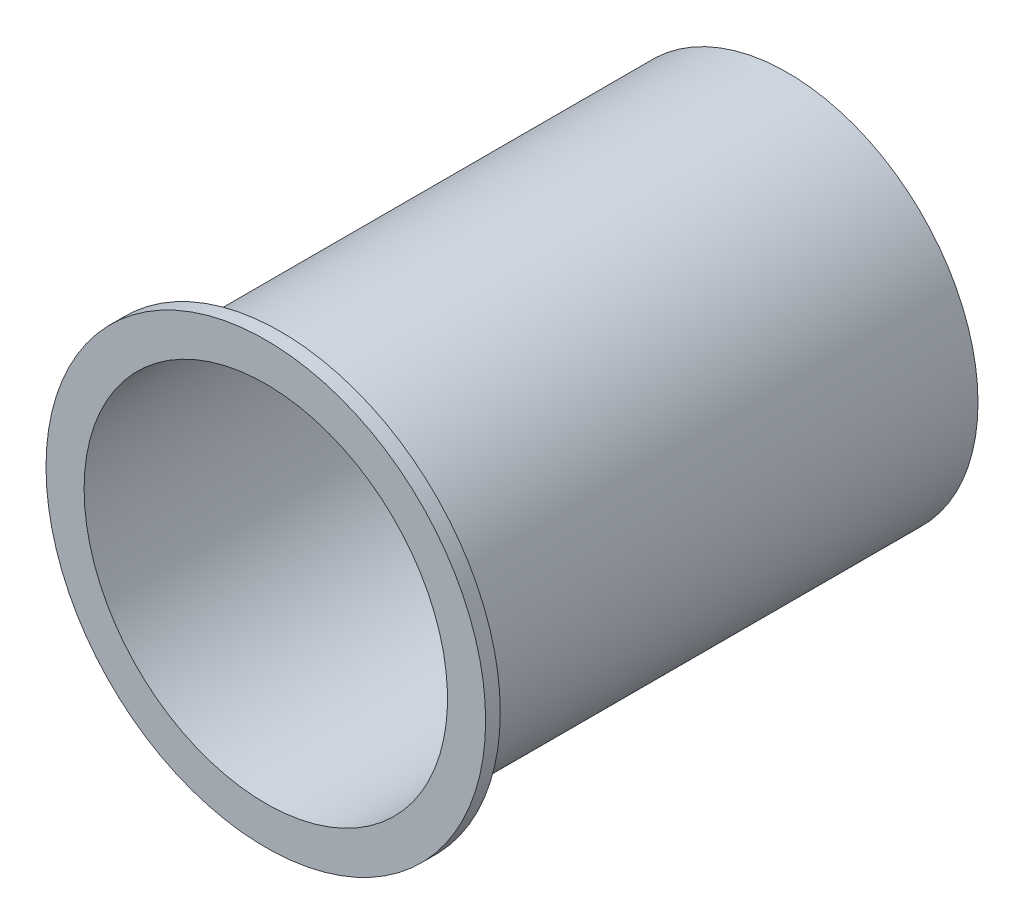
ISO-10303-21;
HEADER;
FILE_DESCRIPTION(('STEP AP214'),'2;1');
FILE_NAME('part.step','',(''),(''),'','','');
FILE_SCHEMA(('AUTOMOTIVE_DESIGN { 1 0 10303 214 1 1 1 1 }'));
ENDSEC;
DATA;
#1=APPLICATION_CONTEXT('core data for automotive mechanical design processes');
#2=APPLICATION_PROTOCOL_DEFINITION('international standard','automotive_design',2000,#1);
#3=PRODUCT_CONTEXT('',#1,'mechanical');
#4=PRODUCT('Part','Part','',(#3));
#5=PRODUCT_RELATED_PRODUCT_CATEGORY('part','',(#4));
#6=PRODUCT_DEFINITION_FORMATION('','',#4);
#7=PRODUCT_DEFINITION_CONTEXT('part definition',#1,'design');
#8=PRODUCT_DEFINITION('design','',#6,#7);
#9=PRODUCT_DEFINITION_SHAPE('','',#8);
#10=(LENGTH_UNIT() NAMED_UNIT(*) SI_UNIT(.MILLI.,.METRE.));
#11=(NAMED_UNIT(*) PLANE_ANGLE_UNIT() SI_UNIT($,.RADIAN.));
#12=(NAMED_UNIT(*) SI_UNIT($,.STERADIAN.) SOLID_ANGLE_UNIT());
#13=UNCERTAINTY_MEASURE_WITH_UNIT(LENGTH_MEASURE(1.E-05),#10,'distance_accuracy_value','');
#14=(GEOMETRIC_REPRESENTATION_CONTEXT(3) GLOBAL_UNCERTAINTY_ASSIGNED_CONTEXT((#13)) GLOBAL_UNIT_ASSIGNED_CONTEXT((#10,
#11,#12)) REPRESENTATION_CONTEXT('',''));
#15=CARTESIAN_POINT('',(0.,0.,0.));
#16=DIRECTION('',(0.,0.,1.));
#17=DIRECTION('',(1.,0.,0.));
#18=AXIS2_PLACEMENT_3D('',#15,#16,#17);
#19=CARTESIAN_POINT('',(0.,0.,0.00386803780377809));
#20=DIRECTION('',(0.,0.,1.));
#21=DIRECTION('',(1.,0.,0.));
#22=AXIS2_PLACEMENT_3D('',#19,#20,#21);
#23=CYLINDRICAL_SURFACE('',#22,62.);
#24=CARTESIAN_POINT('',(0.,0.,178.003868037804));
#25=DIRECTION('',(0.,0.,-1.));
#26=DIRECTION('',(-1.,0.,0.));
#27=AXIS2_PLACEMENT_3D('',#24,#25,#26);
#28=CIRCLE('',#27,62.);
#29=CARTESIAN_POINT('',(-62.,0.,178.003868037804));
#30=VERTEX_POINT('',#29);
#31=EDGE_CURVE('E56',#30,#30,#28,.T.);
#32=ORIENTED_EDGE('',*,*,#31,.F.);
#33=EDGE_LOOP('',(#32));
#34=FACE_BOUND('',#33,.T.);
#35=CARTESIAN_POINT('',(0.,0.,3.00386803780378));
#36=DIRECTION('',(0.,0.,-1.));
#37=DIRECTION('',(-1.,0.,0.));
#38=AXIS2_PLACEMENT_3D('',#35,#36,#37);
#39=CIRCLE('',#38,62.);
#40=CARTESIAN_POINT('',(-62.,0.,3.00386803780378));
#41=VERTEX_POINT('',#40);
#42=EDGE_CURVE('E48',#41,#41,#39,.T.);
#43=ORIENTED_EDGE('',*,*,#42,.T.);
#44=EDGE_LOOP('',(#43));
#45=FACE_BOUND('',#44,.T.);
#46=ADVANCED_FACE('F44',(#34,#45),#23,.F.);
#47=CARTESIAN_POINT('',(0.,0.,0.00386803780377809));
#48=DIRECTION('',(0.,0.,1.));
#49=DIRECTION('',(1.,0.,0.));
#50=AXIS2_PLACEMENT_3D('',#47,#48,#49);
#51=CYLINDRICAL_SURFACE('',#50,65.);
#52=CARTESIAN_POINT('',(0.,0.,0.00386803780377809));
#53=DIRECTION('',(0.,0.,-1.));
#54=DIRECTION('',(-1.,0.,0.));
#55=AXIS2_PLACEMENT_3D('',#52,#53,#54);
#56=CIRCLE('',#55,65.);
#57=CARTESIAN_POINT('',(-65.,0.,0.00386803780377809));
#58=VERTEX_POINT('',#57);
#59=EDGE_CURVE('E52',#58,#58,#56,.T.);
#60=ORIENTED_EDGE('',*,*,#59,.F.);
#61=EDGE_LOOP('',(#60));
#62=FACE_BOUND('',#61,.T.);
#63=CARTESIAN_POINT('',(0.,0.,173.003868037804));
#64=DIRECTION('',(0.,0.,1.));
#65=DIRECTION('',(1.,0.,0.));
#66=AXIS2_PLACEMENT_3D('',#63,#64,#65);
#67=CIRCLE('',#66,65.);
#68=CARTESIAN_POINT('',(65.,0.,173.003868037804));
#69=VERTEX_POINT('',#68);
#70=EDGE_CURVE('E11',#69,#69,#67,.T.);
#71=ORIENTED_EDGE('',*,*,#70,.F.);
#72=EDGE_LOOP('',(#71));
#73=FACE_BOUND('',#72,.T.);
#74=ADVANCED_FACE('F46',(#62,#73),#51,.T.);
#75=CARTESIAN_POINT('',(0.,0.,0.00386803780377809));
#76=DIRECTION('',(0.,0.,-1.));
#77=DIRECTION('',(-1.,0.,0.));
#78=AXIS2_PLACEMENT_3D('',#75,#76,#77);
#79=PLANE('',#78);
#80=ORIENTED_EDGE('',*,*,#59,.T.);
#81=EDGE_LOOP('',(#80));
#82=FACE_BOUND('',#81,.T.);
#83=ADVANCED_FACE('F89',(#82),#79,.T.);
#84=CARTESIAN_POINT('',(0.,0.,178.003868037804));
#85=DIRECTION('',(0.,0.,-1.));
#86=DIRECTION('',(-1.,0.,0.));
#87=AXIS2_PLACEMENT_3D('',#84,#85,#86);
#88=PLANE('',#87);
#89=ORIENTED_EDGE('',*,*,#31,.T.);
#90=EDGE_LOOP('',(#89));
#91=FACE_BOUND('',#90,.T.);
#92=CARTESIAN_POINT('',(0.,0.,178.003868037804));
#93=DIRECTION('',(0.,0.,1.));
#94=DIRECTION('',(1.,0.,0.));
#95=AXIS2_PLACEMENT_3D('',#92,#93,#94);
#96=CIRCLE('',#95,75.);
#97=CARTESIAN_POINT('',(75.,0.,178.003868037804));
#98=VERTEX_POINT('',#97);
#99=EDGE_CURVE('E62',#98,#98,#96,.T.);
#100=ORIENTED_EDGE('',*,*,#99,.T.);
#101=EDGE_LOOP('',(#100));
#102=FACE_BOUND('',#101,.T.);
#103=ADVANCED_FACE('F82',(#91,#102),#88,.F.);
#104=CARTESIAN_POINT('',(0.,0.,173.003868037804));
#105=DIRECTION('',(0.,0.,1.));
#106=DIRECTION('',(1.,0.,0.));
#107=AXIS2_PLACEMENT_3D('',#104,#105,#106);
#108=CYLINDRICAL_SURFACE('',#107,75.);
#109=CARTESIAN_POINT('',(0.,0.,173.003868037804));
#110=DIRECTION('',(0.,0.,1.));
#111=DIRECTION('',(1.,0.,0.));
#112=AXIS2_PLACEMENT_3D('',#109,#110,#111);
#113=CIRCLE('',#112,75.);
#114=CARTESIAN_POINT('',(75.,0.,173.003868037804));
#115=VERTEX_POINT('',#114);
#116=EDGE_CURVE('E61',#115,#115,#113,.T.);
#117=ORIENTED_EDGE('',*,*,#116,.T.);
#118=EDGE_LOOP('',(#117));
#119=FACE_BOUND('',#118,.T.);
#120=ORIENTED_EDGE('',*,*,#99,.F.);
#121=EDGE_LOOP('',(#120));
#122=FACE_BOUND('',#121,.T.);
#123=ADVANCED_FACE('F68',(#119,#122),#108,.T.);
#124=CARTESIAN_POINT('',(0.,0.,173.003868037804));
#125=DIRECTION('',(0.,0.,1.));
#126=DIRECTION('',(1.,0.,0.));
#127=AXIS2_PLACEMENT_3D('',#124,#125,#126);
#128=PLANE('',#127);
#129=ORIENTED_EDGE('',*,*,#70,.T.);
#130=EDGE_LOOP('',(#129));
#131=FACE_BOUND('',#130,.T.);
#132=ORIENTED_EDGE('',*,*,#116,.F.);
#133=EDGE_LOOP('',(#132));
#134=FACE_BOUND('',#133,.T.);
#135=ADVANCED_FACE('F71',(#131,#134),#128,.F.);
#136=CARTESIAN_POINT('',(0.,0.,3.00386803780378));
#137=DIRECTION('',(0.,0.,-1.));
#138=DIRECTION('',(-1.,0.,0.));
#139=AXIS2_PLACEMENT_3D('',#136,#137,#138);
#140=PLANE('',#139);
#141=ORIENTED_EDGE('',*,*,#42,.F.);
#142=EDGE_LOOP('',(#141));
#143=FACE_BOUND('',#142,.T.);
#144=ADVANCED_FACE('F73',(#143),#140,.F.);
#145=CLOSED_SHELL('',(#46,#74,#83,#103,#123,#135,#144));
#146=MANIFOLD_SOLID_BREP('B2',#145);
#147=ADVANCED_BREP_SHAPE_REPRESENTATION('',(#18,#146),#14);
#148=SHAPE_DEFINITION_REPRESENTATION(#9,#147);
ENDSEC;
END-ISO-10303-21;
